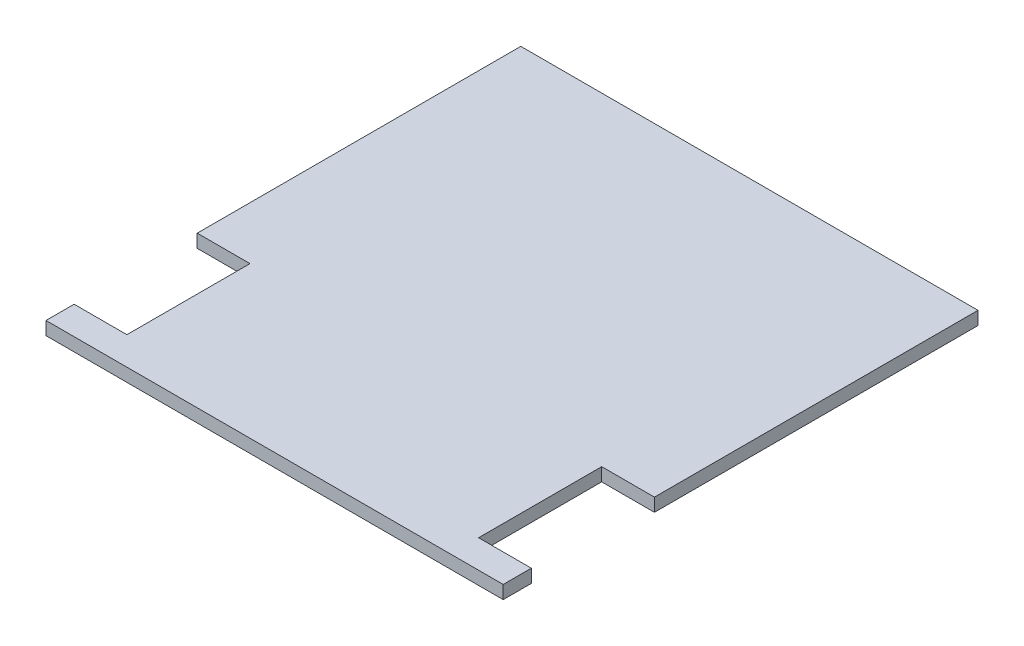
ISO-10303-21;
HEADER;
FILE_DESCRIPTION(('STEP AP214'),'2;1');
FILE_NAME('part.step','',(''),(''),'','','');
FILE_SCHEMA(('AUTOMOTIVE_DESIGN { 1 0 10303 214 1 1 1 1 }'));
ENDSEC;
DATA;
#1=APPLICATION_CONTEXT('core data for automotive mechanical design processes');
#2=APPLICATION_PROTOCOL_DEFINITION('international standard','automotive_design',2000,#1);
#3=PRODUCT_CONTEXT('',#1,'mechanical');
#4=PRODUCT('Part','Part','',(#3));
#5=PRODUCT_RELATED_PRODUCT_CATEGORY('part','',(#4));
#6=PRODUCT_DEFINITION_FORMATION('','',#4);
#7=PRODUCT_DEFINITION_CONTEXT('part definition',#1,'design');
#8=PRODUCT_DEFINITION('design','',#6,#7);
#9=PRODUCT_DEFINITION_SHAPE('','',#8);
#10=(LENGTH_UNIT() NAMED_UNIT(*) SI_UNIT(.MILLI.,.METRE.));
#11=(NAMED_UNIT(*) PLANE_ANGLE_UNIT() SI_UNIT($,.RADIAN.));
#12=(NAMED_UNIT(*) SI_UNIT($,.STERADIAN.) SOLID_ANGLE_UNIT());
#13=UNCERTAINTY_MEASURE_WITH_UNIT(LENGTH_MEASURE(1.E-05),#10,'distance_accuracy_value','');
#14=(GEOMETRIC_REPRESENTATION_CONTEXT(3) GLOBAL_UNCERTAINTY_ASSIGNED_CONTEXT((#13)) GLOBAL_UNIT_ASSIGNED_CONTEXT((#10,
#11,#12)) REPRESENTATION_CONTEXT('',''));
#15=CARTESIAN_POINT('',(0.,0.,0.));
#16=DIRECTION('',(0.,0.,1.));
#17=DIRECTION('',(1.,0.,0.));
#18=AXIS2_PLACEMENT_3D('',#15,#16,#17);
#19=CARTESIAN_POINT('',(-19.3852350722264,0.75,-9.60000000000001));
#20=DIRECTION('',(1.,0.,0.));
#21=DIRECTION('',(0.,0.,-1.));
#22=AXIS2_PLACEMENT_3D('',#19,#20,#21);
#23=PLANE('',#22);
#24=DIRECTION('',(0.,0.,1.));
#25=VECTOR('',#24,1.);
#26=CARTESIAN_POINT('',(-19.3852350722264,0.,-9.60000000000001));
#27=LINE('',#26,#25);
#28=CARTESIAN_POINT('',(-19.3852350722264,0.,-9.60000000000001));
#29=VERTEX_POINT('',#28);
#30=CARTESIAN_POINT('',(-19.3852350722264,0.,-8.00000000000001));
#31=VERTEX_POINT('',#30);
#32=EDGE_CURVE('E155',#29,#31,#27,.T.);
#33=ORIENTED_EDGE('',*,*,#32,.T.);
#34=DIRECTION('',(0.,-1.,0.));
#35=VECTOR('',#34,1.);
#36=CARTESIAN_POINT('',(-19.3852350722264,0.75,-8.00000000000001));
#37=LINE('',#36,#35);
#38=CARTESIAN_POINT('',(-19.3852350722264,0.75,-8.00000000000001));
#39=VERTEX_POINT('',#38);
#40=EDGE_CURVE('E11',#39,#31,#37,.T.);
#41=ORIENTED_EDGE('',*,*,#40,.F.);
#42=DIRECTION('',(0.,0.,1.));
#43=VECTOR('',#42,1.);
#44=CARTESIAN_POINT('',(-19.3852350722264,0.75,-9.60000000000001));
#45=LINE('',#44,#43);
#46=CARTESIAN_POINT('',(-19.3852350722264,0.75,-9.60000000000001));
#47=VERTEX_POINT('',#46);
#48=EDGE_CURVE('E177',#47,#39,#45,.T.);
#49=ORIENTED_EDGE('',*,*,#48,.F.);
#50=DIRECTION('',(0.,-1.,0.));
#51=VECTOR('',#50,1.);
#52=CARTESIAN_POINT('',(-19.3852350722264,0.75,-9.60000000000001));
#53=LINE('',#52,#51);
#54=EDGE_CURVE('E151',#47,#29,#53,.T.);
#55=ORIENTED_EDGE('',*,*,#54,.T.);
#56=EDGE_LOOP('',(#33,#41,#49,#55));
#57=FACE_BOUND('',#56,.T.);
#58=ADVANCED_FACE('F35',(#57),#23,.F.);
#59=CARTESIAN_POINT('',(6.61476492777361,0.75,-8.00000000000001));
#60=DIRECTION('',(0.,0.,-1.));
#61=DIRECTION('',(-1.,0.,0.));
#62=AXIS2_PLACEMENT_3D('',#59,#60,#61);
#63=PLANE('',#62);
#64=DIRECTION('',(1.,0.,0.));
#65=VECTOR('',#64,1.);
#66=CARTESIAN_POINT('',(6.61476492777361,0.,-8.00000000000001));
#67=LINE('',#66,#65);
#68=CARTESIAN_POINT('',(6.61476492777361,0.,-8.00000000000001));
#69=VERTEX_POINT('',#68);
#70=EDGE_CURVE('E158',#31,#69,#67,.T.);
#71=ORIENTED_EDGE('',*,*,#70,.T.);
#72=DIRECTION('',(0.,-1.,0.));
#73=VECTOR('',#72,1.);
#74=CARTESIAN_POINT('',(6.61476492777361,0.75,-8.00000000000001));
#75=LINE('',#74,#73);
#76=CARTESIAN_POINT('',(6.61476492777361,0.75,-8.00000000000001));
#77=VERTEX_POINT('',#76);
#78=EDGE_CURVE('E43',#77,#69,#75,.T.);
#79=ORIENTED_EDGE('',*,*,#78,.F.);
#80=DIRECTION('',(1.,0.,0.));
#81=VECTOR('',#80,1.);
#82=CARTESIAN_POINT('',(6.61476492777361,0.75,-8.00000000000001));
#83=LINE('',#82,#81);
#84=EDGE_CURVE('E106',#39,#77,#83,.T.);
#85=ORIENTED_EDGE('',*,*,#84,.F.);
#86=ORIENTED_EDGE('',*,*,#40,.T.);
#87=EDGE_LOOP('',(#71,#79,#85,#86));
#88=FACE_BOUND('',#87,.T.);
#89=ADVANCED_FACE('F255',(#88),#63,.F.);
#90=CARTESIAN_POINT('',(6.61476492777361,0.75,-9.60000000000001));
#91=DIRECTION('',(-1.,0.,0.));
#92=DIRECTION('',(0.,0.,1.));
#93=AXIS2_PLACEMENT_3D('',#90,#91,#92);
#94=PLANE('',#93);
#95=DIRECTION('',(0.,0.,-1.));
#96=VECTOR('',#95,1.);
#97=CARTESIAN_POINT('',(6.61476492777361,0.,-9.60000000000001));
#98=LINE('',#97,#96);
#99=CARTESIAN_POINT('',(6.61476492777361,0.,-9.60000000000001));
#100=VERTEX_POINT('',#99);
#101=EDGE_CURVE('E160',#69,#100,#98,.T.);
#102=ORIENTED_EDGE('',*,*,#101,.T.);
#103=DIRECTION('',(0.,-1.,0.));
#104=VECTOR('',#103,1.);
#105=CARTESIAN_POINT('',(6.61476492777361,0.75,-9.60000000000001));
#106=LINE('',#105,#104);
#107=CARTESIAN_POINT('',(6.61476492777361,0.75,-9.60000000000001));
#108=VERTEX_POINT('',#107);
#109=EDGE_CURVE('E196',#108,#100,#106,.T.);
#110=ORIENTED_EDGE('',*,*,#109,.F.);
#111=DIRECTION('',(0.,0.,-1.));
#112=VECTOR('',#111,1.);
#113=CARTESIAN_POINT('',(6.61476492777361,0.75,-9.60000000000001));
#114=LINE('',#113,#112);
#115=EDGE_CURVE('E204',#77,#108,#114,.T.);
#116=ORIENTED_EDGE('',*,*,#115,.F.);
#117=ORIENTED_EDGE('',*,*,#78,.T.);
#118=EDGE_LOOP('',(#102,#110,#116,#117));
#119=FACE_BOUND('',#118,.T.);
#120=ADVANCED_FACE('F202',(#119),#94,.F.);
#121=CARTESIAN_POINT('',(3.61476492777361,0.75,-9.60000000000001));
#122=DIRECTION('',(0.,0.,1.));
#123=DIRECTION('',(1.,0.,0.));
#124=AXIS2_PLACEMENT_3D('',#121,#122,#123);
#125=PLANE('',#124);
#126=DIRECTION('',(-1.,0.,0.));
#127=VECTOR('',#126,1.);
#128=CARTESIAN_POINT('',(3.61476492777361,0.,-9.60000000000001));
#129=LINE('',#128,#127);
#130=CARTESIAN_POINT('',(3.61476492777361,0.,-9.60000000000001));
#131=VERTEX_POINT('',#130);
#132=EDGE_CURVE('E162',#100,#131,#129,.T.);
#133=ORIENTED_EDGE('',*,*,#132,.T.);
#134=DIRECTION('',(0.,-1.,0.));
#135=VECTOR('',#134,1.);
#136=CARTESIAN_POINT('',(3.61476492777361,0.75,-9.60000000000001));
#137=LINE('',#136,#135);
#138=CARTESIAN_POINT('',(3.61476492777361,0.75,-9.60000000000001));
#139=VERTEX_POINT('',#138);
#140=EDGE_CURVE('E193',#139,#131,#137,.T.);
#141=ORIENTED_EDGE('',*,*,#140,.F.);
#142=DIRECTION('',(-1.,0.,0.));
#143=VECTOR('',#142,1.);
#144=CARTESIAN_POINT('',(3.61476492777361,0.75,-9.60000000000001));
#145=LINE('',#144,#143);
#146=EDGE_CURVE('E222',#108,#139,#145,.T.);
#147=ORIENTED_EDGE('',*,*,#146,.F.);
#148=ORIENTED_EDGE('',*,*,#109,.T.);
#149=EDGE_LOOP('',(#133,#141,#147,#148));
#150=FACE_BOUND('',#149,.T.);
#151=ADVANCED_FACE('F213',(#150),#125,.F.);
#152=CARTESIAN_POINT('',(3.61476492777361,0.75,-16.6));
#153=DIRECTION('',(-1.,0.,0.));
#154=DIRECTION('',(0.,0.,1.));
#155=AXIS2_PLACEMENT_3D('',#152,#153,#154);
#156=PLANE('',#155);
#157=DIRECTION('',(0.,0.,-1.));
#158=VECTOR('',#157,1.);
#159=CARTESIAN_POINT('',(3.61476492777361,0.,-16.6));
#160=LINE('',#159,#158);
#161=CARTESIAN_POINT('',(3.61476492777361,0.,-16.6));
#162=VERTEX_POINT('',#161);
#163=EDGE_CURVE('E164',#131,#162,#160,.T.);
#164=ORIENTED_EDGE('',*,*,#163,.T.);
#165=DIRECTION('',(0.,-1.,0.));
#166=VECTOR('',#165,1.);
#167=CARTESIAN_POINT('',(3.61476492777361,0.75,-16.6));
#168=LINE('',#167,#166);
#169=CARTESIAN_POINT('',(3.61476492777361,0.75,-16.6));
#170=VERTEX_POINT('',#169);
#171=EDGE_CURVE('E190',#170,#162,#168,.T.);
#172=ORIENTED_EDGE('',*,*,#171,.F.);
#173=DIRECTION('',(0.,0.,-1.));
#174=VECTOR('',#173,1.);
#175=CARTESIAN_POINT('',(3.61476492777361,0.75,-16.6));
#176=LINE('',#175,#174);
#177=EDGE_CURVE('E219',#139,#170,#176,.T.);
#178=ORIENTED_EDGE('',*,*,#177,.F.);
#179=ORIENTED_EDGE('',*,*,#140,.T.);
#180=EDGE_LOOP('',(#164,#172,#178,#179));
#181=FACE_BOUND('',#180,.T.);
#182=ADVANCED_FACE('F217',(#181),#156,.F.);
#183=CARTESIAN_POINT('',(6.61476492777361,0.75,-16.6));
#184=DIRECTION('',(0.,0.,-1.));
#185=DIRECTION('',(-1.,0.,0.));
#186=AXIS2_PLACEMENT_3D('',#183,#184,#185);
#187=PLANE('',#186);
#188=DIRECTION('',(1.,0.,0.));
#189=VECTOR('',#188,1.);
#190=CARTESIAN_POINT('',(6.61476492777361,0.,-16.6));
#191=LINE('',#190,#189);
#192=CARTESIAN_POINT('',(6.61476492777361,0.,-16.6));
#193=VERTEX_POINT('',#192);
#194=EDGE_CURVE('E166',#162,#193,#191,.T.);
#195=ORIENTED_EDGE('',*,*,#194,.T.);
#196=DIRECTION('',(0.,-1.,0.));
#197=VECTOR('',#196,1.);
#198=CARTESIAN_POINT('',(6.61476492777361,0.75,-16.6));
#199=LINE('',#198,#197);
#200=CARTESIAN_POINT('',(6.61476492777361,0.75,-16.6));
#201=VERTEX_POINT('',#200);
#202=EDGE_CURVE('E187',#201,#193,#199,.T.);
#203=ORIENTED_EDGE('',*,*,#202,.F.);
#204=DIRECTION('',(1.,0.,0.));
#205=VECTOR('',#204,1.);
#206=CARTESIAN_POINT('',(6.61476492777361,0.75,-16.6));
#207=LINE('',#206,#205);
#208=EDGE_CURVE('E221',#170,#201,#207,.T.);
#209=ORIENTED_EDGE('',*,*,#208,.F.);
#210=ORIENTED_EDGE('',*,*,#171,.T.);
#211=EDGE_LOOP('',(#195,#203,#209,#210));
#212=FACE_BOUND('',#211,.T.);
#213=ADVANCED_FACE('F268',(#212),#187,.F.);
#214=CARTESIAN_POINT('',(6.6147649277736,0.75,-35.));
#215=DIRECTION('',(-1.,0.,0.));
#216=DIRECTION('',(0.,0.,1.));
#217=AXIS2_PLACEMENT_3D('',#214,#215,#216);
#218=PLANE('',#217);
#219=DIRECTION('',(0.,0.,-1.));
#220=VECTOR('',#219,1.);
#221=CARTESIAN_POINT('',(6.6147649277736,0.,-35.));
#222=LINE('',#221,#220);
#223=CARTESIAN_POINT('',(6.6147649277736,0.,-35.));
#224=VERTEX_POINT('',#223);
#225=EDGE_CURVE('E168',#193,#224,#222,.T.);
#226=ORIENTED_EDGE('',*,*,#225,.T.);
#227=DIRECTION('',(0.,-1.,0.));
#228=VECTOR('',#227,1.);
#229=CARTESIAN_POINT('',(6.6147649277736,0.75,-35.));
#230=LINE('',#229,#228);
#231=CARTESIAN_POINT('',(6.6147649277736,0.75,-35.));
#232=VERTEX_POINT('',#231);
#233=EDGE_CURVE('E184',#232,#224,#230,.T.);
#234=ORIENTED_EDGE('',*,*,#233,.F.);
#235=DIRECTION('',(0.,0.,-1.));
#236=VECTOR('',#235,1.);
#237=CARTESIAN_POINT('',(6.6147649277736,0.75,-35.));
#238=LINE('',#237,#236);
#239=EDGE_CURVE('E224',#201,#232,#238,.T.);
#240=ORIENTED_EDGE('',*,*,#239,.F.);
#241=ORIENTED_EDGE('',*,*,#202,.T.);
#242=EDGE_LOOP('',(#226,#234,#240,#241));
#243=FACE_BOUND('',#242,.T.);
#244=ADVANCED_FACE('F271',(#243),#218,.F.);
#245=CARTESIAN_POINT('',(-19.3852350722264,0.75,-35.));
#246=DIRECTION('',(0.,0.,1.));
#247=DIRECTION('',(1.,0.,0.));
#248=AXIS2_PLACEMENT_3D('',#245,#246,#247);
#249=PLANE('',#248);
#250=DIRECTION('',(-1.,0.,0.));
#251=VECTOR('',#250,1.);
#252=CARTESIAN_POINT('',(-19.3852350722264,0.,-35.));
#253=LINE('',#252,#251);
#254=CARTESIAN_POINT('',(-19.3852350722264,0.,-35.));
#255=VERTEX_POINT('',#254);
#256=EDGE_CURVE('E170',#224,#255,#253,.T.);
#257=ORIENTED_EDGE('',*,*,#256,.T.);
#258=DIRECTION('',(0.,-1.,0.));
#259=VECTOR('',#258,1.);
#260=CARTESIAN_POINT('',(-19.3852350722264,0.75,-35.));
#261=LINE('',#260,#259);
#262=CARTESIAN_POINT('',(-19.3852350722264,0.75,-35.));
#263=VERTEX_POINT('',#262);
#264=EDGE_CURVE('E181',#263,#255,#261,.T.);
#265=ORIENTED_EDGE('',*,*,#264,.F.);
#266=DIRECTION('',(-1.,0.,0.));
#267=VECTOR('',#266,1.);
#268=CARTESIAN_POINT('',(-19.3852350722264,0.75,-35.));
#269=LINE('',#268,#267);
#270=EDGE_CURVE('E230',#232,#263,#269,.T.);
#271=ORIENTED_EDGE('',*,*,#270,.F.);
#272=ORIENTED_EDGE('',*,*,#233,.T.);
#273=EDGE_LOOP('',(#257,#265,#271,#272));
#274=FACE_BOUND('',#273,.T.);
#275=ADVANCED_FACE('F236',(#274),#249,.F.);
#276=CARTESIAN_POINT('',(-19.3852350722264,0.75,-35.));
#277=DIRECTION('',(1.,0.,0.));
#278=DIRECTION('',(0.,0.,-1.));
#279=AXIS2_PLACEMENT_3D('',#276,#277,#278);
#280=PLANE('',#279);
#281=DIRECTION('',(0.,0.,1.));
#282=VECTOR('',#281,1.);
#283=CARTESIAN_POINT('',(-19.3852350722264,0.,-35.));
#284=LINE('',#283,#282);
#285=CARTESIAN_POINT('',(-19.3852350722264,0.,-16.6));
#286=VERTEX_POINT('',#285);
#287=EDGE_CURVE('E172',#255,#286,#284,.T.);
#288=ORIENTED_EDGE('',*,*,#287,.T.);
#289=DIRECTION('',(0.,-1.,0.));
#290=VECTOR('',#289,1.);
#291=CARTESIAN_POINT('',(-19.3852350722264,0.75,-16.6));
#292=LINE('',#291,#290);
#293=CARTESIAN_POINT('',(-19.3852350722264,0.75,-16.6));
#294=VERTEX_POINT('',#293);
#295=EDGE_CURVE('E146',#294,#286,#292,.T.);
#296=ORIENTED_EDGE('',*,*,#295,.F.);
#297=DIRECTION('',(0.,0.,1.));
#298=VECTOR('',#297,1.);
#299=CARTESIAN_POINT('',(-19.3852350722264,0.75,-35.));
#300=LINE('',#299,#298);
#301=EDGE_CURVE('E137',#263,#294,#300,.T.);
#302=ORIENTED_EDGE('',*,*,#301,.F.);
#303=ORIENTED_EDGE('',*,*,#264,.T.);
#304=EDGE_LOOP('',(#288,#296,#302,#303));
#305=FACE_BOUND('',#304,.T.);
#306=ADVANCED_FACE('F240',(#305),#280,.F.);
#307=CARTESIAN_POINT('',(-19.3852350722264,0.75,-16.6));
#308=DIRECTION('',(0.,0.,-1.));
#309=DIRECTION('',(-1.,0.,0.));
#310=AXIS2_PLACEMENT_3D('',#307,#308,#309);
#311=PLANE('',#310);
#312=DIRECTION('',(1.,0.,0.));
#313=VECTOR('',#312,1.);
#314=CARTESIAN_POINT('',(-19.3852350722264,0.,-16.6));
#315=LINE('',#314,#313);
#316=CARTESIAN_POINT('',(-16.3852350722264,0.,-16.6));
#317=VERTEX_POINT('',#316);
#318=EDGE_CURVE('E145',#286,#317,#315,.T.);
#319=ORIENTED_EDGE('',*,*,#318,.T.);
#320=DIRECTION('',(0.,-1.,0.));
#321=VECTOR('',#320,1.);
#322=CARTESIAN_POINT('',(-16.3852350722264,0.75,-16.6));
#323=LINE('',#322,#321);
#324=CARTESIAN_POINT('',(-16.3852350722264,0.75,-16.6));
#325=VERTEX_POINT('',#324);
#326=EDGE_CURVE('E142',#325,#317,#323,.T.);
#327=ORIENTED_EDGE('',*,*,#326,.F.);
#328=DIRECTION('',(1.,0.,0.));
#329=VECTOR('',#328,1.);
#330=CARTESIAN_POINT('',(-19.3852350722264,0.75,-16.6));
#331=LINE('',#330,#329);
#332=EDGE_CURVE('E131',#294,#325,#331,.T.);
#333=ORIENTED_EDGE('',*,*,#332,.F.);
#334=ORIENTED_EDGE('',*,*,#295,.T.);
#335=EDGE_LOOP('',(#319,#327,#333,#334));
#336=FACE_BOUND('',#335,.T.);
#337=ADVANCED_FACE('F143',(#336),#311,.F.);
#338=CARTESIAN_POINT('',(-16.3852350722264,0.75,-16.6));
#339=DIRECTION('',(1.,0.,0.));
#340=DIRECTION('',(0.,0.,-1.));
#341=AXIS2_PLACEMENT_3D('',#338,#339,#340);
#342=PLANE('',#341);
#343=DIRECTION('',(0.,0.,1.));
#344=VECTOR('',#343,1.);
#345=CARTESIAN_POINT('',(-16.3852350722264,0.,-16.6));
#346=LINE('',#345,#344);
#347=CARTESIAN_POINT('',(-16.3852350722264,0.,-9.60000000000001));
#348=VERTEX_POINT('',#347);
#349=EDGE_CURVE('E92',#317,#348,#346,.T.);
#350=ORIENTED_EDGE('',*,*,#349,.T.);
#351=DIRECTION('',(0.,-1.,0.));
#352=VECTOR('',#351,1.);
#353=CARTESIAN_POINT('',(-16.3852350722264,0.75,-9.60000000000001));
#354=LINE('',#353,#352);
#355=CARTESIAN_POINT('',(-16.3852350722264,0.75,-9.60000000000001));
#356=VERTEX_POINT('',#355);
#357=EDGE_CURVE('E147',#356,#348,#354,.T.);
#358=ORIENTED_EDGE('',*,*,#357,.F.);
#359=DIRECTION('',(0.,0.,1.));
#360=VECTOR('',#359,1.);
#361=CARTESIAN_POINT('',(-16.3852350722264,0.75,-16.6));
#362=LINE('',#361,#360);
#363=EDGE_CURVE('E135',#325,#356,#362,.T.);
#364=ORIENTED_EDGE('',*,*,#363,.F.);
#365=ORIENTED_EDGE('',*,*,#326,.T.);
#366=EDGE_LOOP('',(#350,#358,#364,#365));
#367=FACE_BOUND('',#366,.T.);
#368=ADVANCED_FACE('F149',(#367),#342,.F.);
#369=CARTESIAN_POINT('',(-16.3852350722264,0.75,-9.60000000000001));
#370=DIRECTION('',(0.,0.,1.));
#371=DIRECTION('',(1.,0.,0.));
#372=AXIS2_PLACEMENT_3D('',#369,#370,#371);
#373=PLANE('',#372);
#374=DIRECTION('',(-1.,0.,0.));
#375=VECTOR('',#374,1.);
#376=CARTESIAN_POINT('',(-16.3852350722264,0.,-9.60000000000001));
#377=LINE('',#376,#375);
#378=EDGE_CURVE('E98',#348,#29,#377,.T.);
#379=ORIENTED_EDGE('',*,*,#378,.T.);
#380=ORIENTED_EDGE('',*,*,#54,.F.);
#381=DIRECTION('',(-1.,0.,0.));
#382=VECTOR('',#381,1.);
#383=CARTESIAN_POINT('',(-16.3852350722264,0.75,-9.60000000000001));
#384=LINE('',#383,#382);
#385=EDGE_CURVE('E51',#356,#47,#384,.T.);
#386=ORIENTED_EDGE('',*,*,#385,.F.);
#387=ORIENTED_EDGE('',*,*,#357,.T.);
#388=EDGE_LOOP('',(#379,#380,#386,#387));
#389=FACE_BOUND('',#388,.T.);
#390=ADVANCED_FACE('F244',(#389),#373,.F.);
#391=CARTESIAN_POINT('',(0.,0.75,0.));
#392=DIRECTION('',(0.,-1.,0.));
#393=DIRECTION('',(0.,0.,-1.));
#394=AXIS2_PLACEMENT_3D('',#391,#392,#393);
#395=PLANE('',#394);
#396=ORIENTED_EDGE('',*,*,#48,.T.);
#397=ORIENTED_EDGE('',*,*,#84,.T.);
#398=ORIENTED_EDGE('',*,*,#115,.T.);
#399=ORIENTED_EDGE('',*,*,#146,.T.);
#400=ORIENTED_EDGE('',*,*,#177,.T.);
#401=ORIENTED_EDGE('',*,*,#208,.T.);
#402=ORIENTED_EDGE('',*,*,#239,.T.);
#403=ORIENTED_EDGE('',*,*,#270,.T.);
#404=ORIENTED_EDGE('',*,*,#301,.T.);
#405=ORIENTED_EDGE('',*,*,#332,.T.);
#406=ORIENTED_EDGE('',*,*,#363,.T.);
#407=ORIENTED_EDGE('',*,*,#385,.T.);
#408=EDGE_LOOP('',(#396,#397,#398,#399,#400,#401,#402,#403,#404,#405,#406,#407));
#409=FACE_BOUND('',#408,.T.);
#410=ADVANCED_FACE('F133',(#409),#395,.F.);
#411=CARTESIAN_POINT('',(0.,0.,0.));
#412=DIRECTION('',(0.,-1.,0.));
#413=DIRECTION('',(0.,0.,-1.));
#414=AXIS2_PLACEMENT_3D('',#411,#412,#413);
#415=PLANE('',#414);
#416=ORIENTED_EDGE('',*,*,#32,.F.);
#417=ORIENTED_EDGE('',*,*,#378,.F.);
#418=ORIENTED_EDGE('',*,*,#349,.F.);
#419=ORIENTED_EDGE('',*,*,#318,.F.);
#420=ORIENTED_EDGE('',*,*,#287,.F.);
#421=ORIENTED_EDGE('',*,*,#256,.F.);
#422=ORIENTED_EDGE('',*,*,#225,.F.);
#423=ORIENTED_EDGE('',*,*,#194,.F.);
#424=ORIENTED_EDGE('',*,*,#163,.F.);
#425=ORIENTED_EDGE('',*,*,#132,.F.);
#426=ORIENTED_EDGE('',*,*,#101,.F.);
#427=ORIENTED_EDGE('',*,*,#70,.F.);
#428=EDGE_LOOP('',(#416,#417,#418,#419,#420,#421,#422,#423,#424,#425,#426,#427));
#429=FACE_BOUND('',#428,.T.);
#430=ADVANCED_FACE('F208',(#429),#415,.T.);
#431=CLOSED_SHELL('',(#58,#89,#120,#151,#182,#213,#244,#275,#306,#337,#368,#390,#410,#430));
#432=MANIFOLD_SOLID_BREP('B2',#431);
#433=ADVANCED_BREP_SHAPE_REPRESENTATION('',(#18,#432),#14);
#434=SHAPE_DEFINITION_REPRESENTATION(#9,#433);
ENDSEC;
END-ISO-10303-21;
